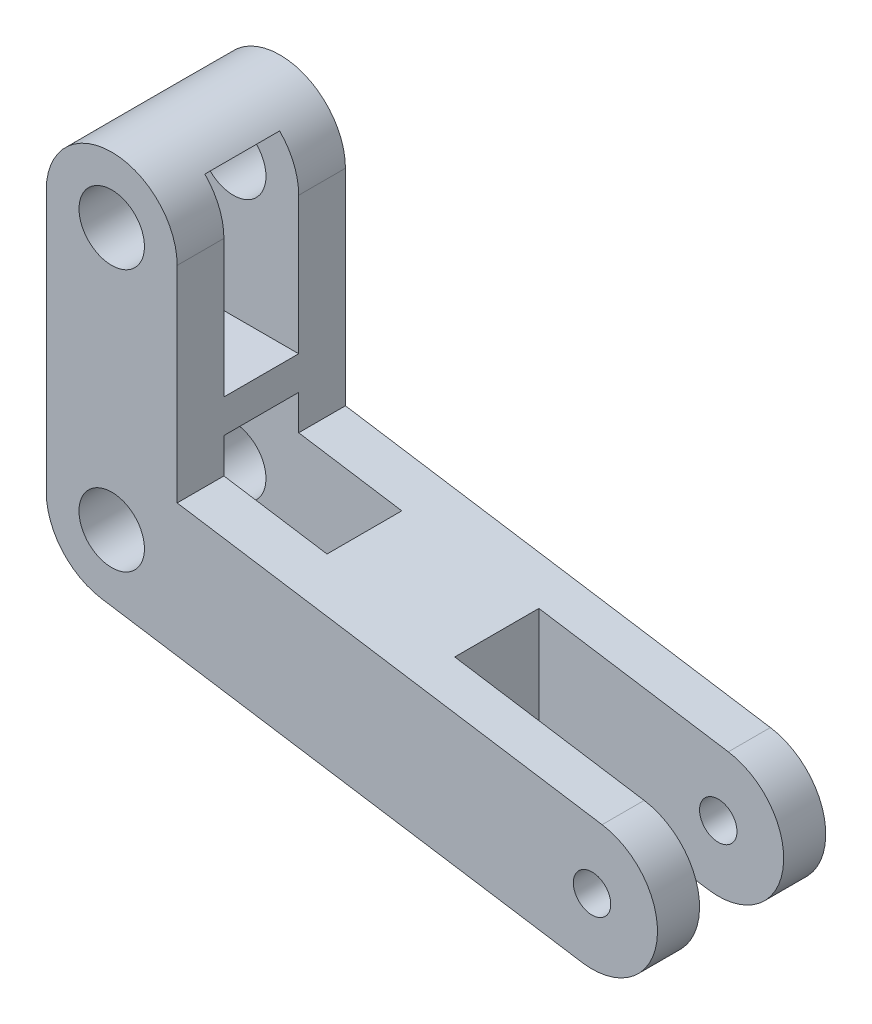
ISO-10303-21;
HEADER;
FILE_DESCRIPTION(('STEP AP214'),'2;1');
FILE_NAME('part.step','',(''),(''),'','','');
FILE_SCHEMA(('AUTOMOTIVE_DESIGN { 1 0 10303 214 1 1 1 1 }'));
ENDSEC;
DATA;
#1=APPLICATION_CONTEXT('core data for automotive mechanical design processes');
#2=APPLICATION_PROTOCOL_DEFINITION('international standard','automotive_design',2000,#1);
#3=PRODUCT_CONTEXT('',#1,'mechanical');
#4=PRODUCT('Part','Part','',(#3));
#5=PRODUCT_RELATED_PRODUCT_CATEGORY('part','',(#4));
#6=PRODUCT_DEFINITION_FORMATION('','',#4);
#7=PRODUCT_DEFINITION_CONTEXT('part definition',#1,'design');
#8=PRODUCT_DEFINITION('design','',#6,#7);
#9=PRODUCT_DEFINITION_SHAPE('','',#8);
#10=(LENGTH_UNIT() NAMED_UNIT(*) SI_UNIT(.MILLI.,.METRE.));
#11=(NAMED_UNIT(*) PLANE_ANGLE_UNIT() SI_UNIT($,.RADIAN.));
#12=(NAMED_UNIT(*) SI_UNIT($,.STERADIAN.) SOLID_ANGLE_UNIT());
#13=UNCERTAINTY_MEASURE_WITH_UNIT(LENGTH_MEASURE(1.E-05),#10,'distance_accuracy_value','');
#14=(GEOMETRIC_REPRESENTATION_CONTEXT(3) GLOBAL_UNCERTAINTY_ASSIGNED_CONTEXT((#13)) GLOBAL_UNIT_ASSIGNED_CONTEXT((#10,
#11,#12)) REPRESENTATION_CONTEXT('',''));
#15=CARTESIAN_POINT('',(0.,0.,0.));
#16=DIRECTION('',(0.,0.,1.));
#17=DIRECTION('',(1.,0.,0.));
#18=AXIS2_PLACEMENT_3D('',#15,#16,#17);
#19=CARTESIAN_POINT('',(25.6904651573303,-4.,4.5));
#20=DIRECTION('',(0.,0.,-1.));
#21=DIRECTION('',(-1.,0.,0.));
#22=AXIS2_PLACEMENT_3D('',#19,#20,#21);
#23=CYLINDRICAL_SURFACE('',#22,3.5);
#24=CARTESIAN_POINT('',(25.6904651573303,-4.,-2.25));
#25=DIRECTION('',(0.,0.,1.));
#26=DIRECTION('',(1.,0.,0.));
#27=AXIS2_PLACEMENT_3D('',#24,#25,#26);
#28=CIRCLE('',#27,3.5);
#29=CARTESIAN_POINT('',(25.1520036188687,-7.45833184810215,-2.25));
#30=VERTEX_POINT('',#29);
#31=CARTESIAN_POINT('',(26.2289266957918,-0.541668151897848,-2.25));
#32=VERTEX_POINT('',#31);
#33=EDGE_CURVE('E231',#30,#32,#28,.T.);
#34=ORIENTED_EDGE('',*,*,#33,.F.);
#35=DIRECTION('',(0.,0.,-1.));
#36=VECTOR('',#35,1.);
#37=CARTESIAN_POINT('',(25.1520036188687,-7.45833184810215,4.5));
#38=LINE('',#37,#36);
#39=CARTESIAN_POINT('',(25.1520036188687,-7.45833184810215,-4.5));
#40=VERTEX_POINT('',#39);
#41=EDGE_CURVE('E343',#30,#40,#38,.T.);
#42=ORIENTED_EDGE('',*,*,#41,.T.);
#43=CARTESIAN_POINT('',(25.6904651573303,-4.,-4.5));
#44=DIRECTION('',(0.,0.,1.));
#45=DIRECTION('',(1.,0.,0.));
#46=AXIS2_PLACEMENT_3D('',#43,#44,#45);
#47=CIRCLE('',#46,3.5);
#48=CARTESIAN_POINT('',(26.2289266957918,-0.541668151897848,-4.5));
#49=VERTEX_POINT('',#48);
#50=EDGE_CURVE('E324',#40,#49,#47,.T.);
#51=ORIENTED_EDGE('',*,*,#50,.T.);
#52=DIRECTION('',(0.,0.,-1.));
#53=VECTOR('',#52,1.);
#54=CARTESIAN_POINT('',(26.2289266957918,-0.541668151897848,4.5));
#55=LINE('',#54,#53);
#56=EDGE_CURVE('E386',#32,#49,#55,.T.);
#57=ORIENTED_EDGE('',*,*,#56,.F.);
#58=EDGE_LOOP('',(#34,#42,#51,#57));
#59=FACE_BOUND('',#58,.T.);
#60=ADVANCED_FACE('F41',(#59),#23,.T.);
#61=CARTESIAN_POINT('',(26.2289266957918,-0.541668151897848,4.5));
#62=DIRECTION('',(-0.153846153846154,-0.988094813743472,0.));
#63=DIRECTION('',(0.988094813743472,-0.153846153846154,0.));
#64=AXIS2_PLACEMENT_3D('',#61,#62,#63);
#65=PLANE('',#64);
#66=DIRECTION('',(-0.988094813743472,0.153846153846154,0.));
#67=VECTOR('',#66,1.);
#68=CARTESIAN_POINT('',(26.2289266957918,-0.541668151897848,-2.25));
#69=LINE('',#68,#67);
#70=CARTESIAN_POINT('',(16.0970559002648,1.03586199144189,-2.25));
#71=VERTEX_POINT('',#70);
#72=EDGE_CURVE('E213',#32,#71,#69,.T.);
#73=ORIENTED_EDGE('',*,*,#72,.F.);
#74=ORIENTED_EDGE('',*,*,#56,.T.);
#75=DIRECTION('',(-0.988094813743471,0.153846153846154,0.));
#76=VECTOR('',#75,1.);
#77=CARTESIAN_POINT('',(26.2289266957918,-0.541668151897848,-4.5));
#78=LINE('',#77,#76);
#79=CARTESIAN_POINT('',(3.50000000000001,2.99722093502187,-4.5));
#80=VERTEX_POINT('',#79);
#81=EDGE_CURVE('E346',#49,#80,#78,.T.);
#82=ORIENTED_EDGE('',*,*,#81,.T.);
#83=DIRECTION('',(0.,0.,-1.));
#84=VECTOR('',#83,1.);
#85=CARTESIAN_POINT('',(3.50000000000001,2.99722093502187,4.5));
#86=LINE('',#85,#84);
#87=CARTESIAN_POINT('',(3.50000000000001,2.99722093502187,-2.));
#88=VERTEX_POINT('',#87);
#89=EDGE_CURVE('E382',#88,#80,#86,.T.);
#90=ORIENTED_EDGE('',*,*,#89,.F.);
#91=DIRECTION('',(0.988094813743472,-0.153846153846154,0.));
#92=VECTOR('',#91,1.);
#93=CARTESIAN_POINT('',(26.2289266957918,-0.541668151897848,-2.));
#94=LINE('',#93,#92);
#95=CARTESIAN_POINT('',(9.01483292771079,2.13856261273186,-2.));
#96=VERTEX_POINT('',#95);
#97=EDGE_CURVE('E299',#88,#96,#94,.T.);
#98=ORIENTED_EDGE('',*,*,#97,.T.);
#99=DIRECTION('',(0.,0.,1.));
#100=VECTOR('',#99,1.);
#101=CARTESIAN_POINT('',(9.01483292771079,2.13856261273186,4.5));
#102=LINE('',#101,#100);
#103=CARTESIAN_POINT('',(9.01483292771079,2.13856261273186,2.));
#104=VERTEX_POINT('',#103);
#105=EDGE_CURVE('E302',#96,#104,#102,.T.);
#106=ORIENTED_EDGE('',*,*,#105,.T.);
#107=DIRECTION('',(0.988094813743472,-0.153846153846154,0.));
#108=VECTOR('',#107,1.);
#109=CARTESIAN_POINT('',(26.2289266957918,-0.541668151897848,2.));
#110=LINE('',#109,#108);
#111=CARTESIAN_POINT('',(3.50000000000001,2.99722093502187,2.));
#112=VERTEX_POINT('',#111);
#113=EDGE_CURVE('E284',#112,#104,#110,.T.);
#114=ORIENTED_EDGE('',*,*,#113,.F.);
#115=CARTESIAN_POINT('',(3.50000000000001,2.99722093502187,4.5));
#116=VERTEX_POINT('',#115);
#117=EDGE_CURVE('E383',#116,#112,#86,.T.);
#118=ORIENTED_EDGE('',*,*,#117,.F.);
#119=DIRECTION('',(-0.988094813743471,0.153846153846154,0.));
#120=VECTOR('',#119,1.);
#121=CARTESIAN_POINT('',(26.2289266957918,-0.541668151897848,4.5));
#122=LINE('',#121,#120);
#123=CARTESIAN_POINT('',(26.2289266957918,-0.541668151897848,4.5));
#124=VERTEX_POINT('',#123);
#125=EDGE_CURVE('E330',#124,#116,#122,.T.);
#126=ORIENTED_EDGE('',*,*,#125,.F.);
#127=CARTESIAN_POINT('',(26.2289266957918,-0.541668151897848,2.25));
#128=VERTEX_POINT('',#127);
#129=EDGE_CURVE('E222',#124,#128,#55,.T.);
#130=ORIENTED_EDGE('',*,*,#129,.T.);
#131=DIRECTION('',(-0.988094813743472,0.153846153846154,0.));
#132=VECTOR('',#131,1.);
#133=CARTESIAN_POINT('',(26.2289266957918,-0.541668151897848,2.25));
#134=LINE('',#133,#132);
#135=CARTESIAN_POINT('',(16.0970559002648,1.03586199144189,2.25));
#136=VERTEX_POINT('',#135);
#137=EDGE_CURVE('E216',#128,#136,#134,.T.);
#138=ORIENTED_EDGE('',*,*,#137,.T.);
#139=DIRECTION('',(0.,0.,-1.));
#140=VECTOR('',#139,1.);
#141=CARTESIAN_POINT('',(16.0970559002648,1.03586199144189,4.5));
#142=LINE('',#141,#140);
#143=EDGE_CURVE('E203',#136,#71,#142,.T.);
#144=ORIENTED_EDGE('',*,*,#143,.T.);
#145=EDGE_LOOP('',(#73,#74,#82,#90,#98,#106,#114,#118,#126,#130,#138,#144));
#146=FACE_BOUND('',#145,.T.);
#147=ADVANCED_FACE('F220',(#146),#65,.F.);
#148=CARTESIAN_POINT('',(25.1520036188687,-7.45833184810215,4.5));
#149=DIRECTION('',(0.153846153846154,0.988094813743472,0.));
#150=DIRECTION('',(-0.988094813743472,0.153846153846154,0.));
#151=AXIS2_PLACEMENT_3D('',#148,#149,#150);
#152=PLANE('',#151);
#153=DIRECTION('',(0.988094813743472,-0.153846153846154,0.));
#154=VECTOR('',#153,1.);
#155=CARTESIAN_POINT('',(25.1520036188687,-7.45833184810215,-2.25));
#156=LINE('',#155,#154);
#157=CARTESIAN_POINT('',(16.0970559002648,-6.04847840042797,-2.25));
#158=VERTEX_POINT('',#157);
#159=EDGE_CURVE('E226',#158,#30,#156,.T.);
#160=ORIENTED_EDGE('',*,*,#159,.F.);
#161=DIRECTION('',(0.,0.,1.));
#162=VECTOR('',#161,1.);
#163=CARTESIAN_POINT('',(16.0970559002648,-6.04847840042797,4.5));
#164=LINE('',#163,#162);
#165=CARTESIAN_POINT('',(16.0970559002648,-6.04847840042797,2.25));
#166=VERTEX_POINT('',#165);
#167=EDGE_CURVE('E11',#158,#166,#164,.T.);
#168=ORIENTED_EDGE('',*,*,#167,.T.);
#169=DIRECTION('',(0.988094813743472,-0.153846153846154,0.));
#170=VECTOR('',#169,1.);
#171=CARTESIAN_POINT('',(25.1520036188687,-7.45833184810215,2.25));
#172=LINE('',#171,#170);
#173=CARTESIAN_POINT('',(25.1520036188687,-7.45833184810215,2.25));
#174=VERTEX_POINT('',#173);
#175=EDGE_CURVE('E217',#166,#174,#172,.T.);
#176=ORIENTED_EDGE('',*,*,#175,.T.);
#177=CARTESIAN_POINT('',(25.1520036188687,-7.45833184810215,4.5));
#178=VERTEX_POINT('',#177);
#179=EDGE_CURVE('E363',#178,#174,#38,.T.);
#180=ORIENTED_EDGE('',*,*,#179,.F.);
#181=DIRECTION('',(0.988094813743471,-0.153846153846154,0.));
#182=VECTOR('',#181,1.);
#183=CARTESIAN_POINT('',(25.1520036188687,-7.45833184810215,4.5));
#184=LINE('',#183,#182);
#185=CARTESIAN_POINT('',(-0.538461538461539,-3.45833184810215,4.5));
#186=VERTEX_POINT('',#185);
#187=EDGE_CURVE('E341',#186,#178,#184,.T.);
#188=ORIENTED_EDGE('',*,*,#187,.F.);
#189=DIRECTION('',(0.,0.,-1.));
#190=VECTOR('',#189,1.);
#191=CARTESIAN_POINT('',(-0.538461538461539,-3.45833184810215,4.5));
#192=LINE('',#191,#190);
#193=CARTESIAN_POINT('',(-0.53846153846154,-3.45833184810215,2.));
#194=VERTEX_POINT('',#193);
#195=EDGE_CURVE('E367',#186,#194,#192,.T.);
#196=ORIENTED_EDGE('',*,*,#195,.T.);
#197=DIRECTION('',(-0.988094813743472,0.153846153846154,0.));
#198=VECTOR('',#197,1.);
#199=CARTESIAN_POINT('',(25.1520036188687,-7.45833184810215,2.));
#200=LINE('',#199,#198);
#201=CARTESIAN_POINT('',(9.01483292771079,-4.94577777913801,2.));
#202=VERTEX_POINT('',#201);
#203=EDGE_CURVE('E275',#202,#194,#200,.T.);
#204=ORIENTED_EDGE('',*,*,#203,.F.);
#205=DIRECTION('',(0.,0.,-1.));
#206=VECTOR('',#205,1.);
#207=CARTESIAN_POINT('',(9.01483292771079,-4.94577777913801,4.5));
#208=LINE('',#207,#206);
#209=CARTESIAN_POINT('',(9.01483292771079,-4.94577777913801,-2.));
#210=VERTEX_POINT('',#209);
#211=EDGE_CURVE('E388',#202,#210,#208,.T.);
#212=ORIENTED_EDGE('',*,*,#211,.T.);
#213=DIRECTION('',(-0.988094813743472,0.153846153846154,0.));
#214=VECTOR('',#213,1.);
#215=CARTESIAN_POINT('',(25.1520036188687,-7.45833184810215,-2.));
#216=LINE('',#215,#214);
#217=CARTESIAN_POINT('',(-0.53846153846154,-3.45833184810215,-2.));
#218=VERTEX_POINT('',#217);
#219=EDGE_CURVE('E287',#210,#218,#216,.T.);
#220=ORIENTED_EDGE('',*,*,#219,.T.);
#221=CARTESIAN_POINT('',(-0.538461538461539,-3.45833184810215,-4.5));
#222=VERTEX_POINT('',#221);
#223=EDGE_CURVE('E366',#218,#222,#192,.T.);
#224=ORIENTED_EDGE('',*,*,#223,.T.);
#225=DIRECTION('',(0.988094813743471,-0.153846153846154,0.));
#226=VECTOR('',#225,1.);
#227=CARTESIAN_POINT('',(25.1520036188687,-7.45833184810215,-4.5));
#228=LINE('',#227,#226);
#229=EDGE_CURVE('E331',#222,#40,#228,.T.);
#230=ORIENTED_EDGE('',*,*,#229,.T.);
#231=ORIENTED_EDGE('',*,*,#41,.F.);
#232=EDGE_LOOP('',(#160,#168,#176,#180,#188,#196,#204,#212,#220,#224,#230,#231));
#233=FACE_BOUND('',#232,.T.);
#234=ADVANCED_FACE('F421',(#233),#152,.F.);
#235=CARTESIAN_POINT('',(25.6904651573303,-4.,4.5));
#236=DIRECTION('',(0.,0.,-1.));
#237=DIRECTION('',(-1.,0.,0.));
#238=AXIS2_PLACEMENT_3D('',#235,#236,#237);
#239=CYLINDRICAL_SURFACE('',#238,0.999999999999998);
#240=CARTESIAN_POINT('',(25.6904651573303,-4.,-4.5));
#241=DIRECTION('',(0.,0.,1.));
#242=DIRECTION('',(1.,0.,0.));
#243=AXIS2_PLACEMENT_3D('',#240,#241,#242);
#244=CIRCLE('',#243,0.999999999999998);
#245=CARTESIAN_POINT('',(26.6904651573303,-4.,-4.5));
#246=VERTEX_POINT('',#245);
#247=EDGE_CURVE('E312',#246,#246,#244,.T.);
#248=ORIENTED_EDGE('',*,*,#247,.F.);
#249=EDGE_LOOP('',(#248));
#250=FACE_BOUND('',#249,.T.);
#251=CARTESIAN_POINT('',(25.6904651573303,-4.,-2.25));
#252=DIRECTION('',(0.,0.,1.));
#253=DIRECTION('',(1.,0.,0.));
#254=AXIS2_PLACEMENT_3D('',#251,#252,#253);
#255=CIRCLE('',#254,0.999999999999998);
#256=CARTESIAN_POINT('',(26.6904651573303,-4.,-2.25));
#257=VERTEX_POINT('',#256);
#258=EDGE_CURVE('E223',#257,#257,#255,.T.);
#259=ORIENTED_EDGE('',*,*,#258,.T.);
#260=EDGE_LOOP('',(#259));
#261=FACE_BOUND('',#260,.T.);
#262=ADVANCED_FACE('F495',(#250,#261),#239,.F.);
#263=CARTESIAN_POINT('',(3.5,14.,4.5));
#264=DIRECTION('',(-1.,0.,0.));
#265=DIRECTION('',(0.,-1.,0.));
#266=AXIS2_PLACEMENT_3D('',#263,#264,#265);
#267=PLANE('',#266);
#268=DIRECTION('',(0.,1.,0.));
#269=VECTOR('',#268,1.);
#270=CARTESIAN_POINT('',(3.5,16.4698635435501,-2.));
#271=LINE('',#270,#269);
#272=CARTESIAN_POINT('',(3.5,6.65669603838257,-2.));
#273=VERTEX_POINT('',#272);
#274=CARTESIAN_POINT('',(3.5,14.,-2.));
#275=VERTEX_POINT('',#274);
#276=EDGE_CURVE('E236',#273,#275,#271,.T.);
#277=ORIENTED_EDGE('',*,*,#276,.F.);
#278=DIRECTION('',(0.,0.,1.));
#279=VECTOR('',#278,1.);
#280=CARTESIAN_POINT('',(3.5,6.65669603838257,-2.));
#281=LINE('',#280,#279);
#282=CARTESIAN_POINT('',(3.5,6.65669603838257,2.));
#283=VERTEX_POINT('',#282);
#284=EDGE_CURVE('E242',#273,#283,#281,.T.);
#285=ORIENTED_EDGE('',*,*,#284,.T.);
#286=DIRECTION('',(0.,1.,0.));
#287=VECTOR('',#286,1.);
#288=CARTESIAN_POINT('',(3.5,16.4698635435501,2.));
#289=LINE('',#288,#287);
#290=CARTESIAN_POINT('',(3.5,14.,2.));
#291=VERTEX_POINT('',#290);
#292=EDGE_CURVE('E245',#283,#291,#289,.T.);
#293=ORIENTED_EDGE('',*,*,#292,.T.);
#294=DIRECTION('',(0.,0.,-1.));
#295=VECTOR('',#294,1.);
#296=CARTESIAN_POINT('',(3.5,14.,4.5));
#297=LINE('',#296,#295);
#298=CARTESIAN_POINT('',(3.5,14.,4.5));
#299=VERTEX_POINT('',#298);
#300=EDGE_CURVE('E379',#299,#291,#297,.T.);
#301=ORIENTED_EDGE('',*,*,#300,.F.);
#302=DIRECTION('',(0.,1.,0.));
#303=VECTOR('',#302,1.);
#304=CARTESIAN_POINT('',(3.5,14.,4.5));
#305=LINE('',#304,#303);
#306=EDGE_CURVE('E333',#116,#299,#305,.T.);
#307=ORIENTED_EDGE('',*,*,#306,.F.);
#308=ORIENTED_EDGE('',*,*,#117,.T.);
#309=DIRECTION('',(0.,-1.,0.));
#310=VECTOR('',#309,1.);
#311=CARTESIAN_POINT('',(3.5,14.,2.));
#312=LINE('',#311,#310);
#313=CARTESIAN_POINT('',(3.50000000000001,4.86934920884361,2.));
#314=VERTEX_POINT('',#313);
#315=EDGE_CURVE('E282',#314,#112,#312,.T.);
#316=ORIENTED_EDGE('',*,*,#315,.F.);
#317=DIRECTION('',(0.,0.,-1.));
#318=VECTOR('',#317,1.);
#319=CARTESIAN_POINT('',(3.50000000000001,4.86934920884361,4.5));
#320=LINE('',#319,#318);
#321=CARTESIAN_POINT('',(3.50000000000001,4.86934920884361,-2.));
#322=VERTEX_POINT('',#321);
#323=EDGE_CURVE('E305',#314,#322,#320,.T.);
#324=ORIENTED_EDGE('',*,*,#323,.T.);
#325=DIRECTION('',(0.,-1.,0.));
#326=VECTOR('',#325,1.);
#327=CARTESIAN_POINT('',(3.5,14.,-2.));
#328=LINE('',#327,#326);
#329=EDGE_CURVE('E296',#322,#88,#328,.T.);
#330=ORIENTED_EDGE('',*,*,#329,.T.);
#331=ORIENTED_EDGE('',*,*,#89,.T.);
#332=DIRECTION('',(0.,1.,0.));
#333=VECTOR('',#332,1.);
#334=CARTESIAN_POINT('',(3.5,14.,-4.5));
#335=LINE('',#334,#333);
#336=CARTESIAN_POINT('',(3.5,14.,-4.5));
#337=VERTEX_POINT('',#336);
#338=EDGE_CURVE('E349',#80,#337,#335,.T.);
#339=ORIENTED_EDGE('',*,*,#338,.T.);
#340=EDGE_CURVE('E378',#275,#337,#297,.T.);
#341=ORIENTED_EDGE('',*,*,#340,.F.);
#342=EDGE_LOOP('',(#277,#285,#293,#301,#307,#308,#316,#324,#330,#331,#339,#341));
#343=FACE_BOUND('',#342,.T.);
#344=ADVANCED_FACE('F437',(#343),#267,.F.);
#345=CARTESIAN_POINT('',(0.,14.,4.5));
#346=DIRECTION('',(0.,0.,-1.));
#347=DIRECTION('',(-1.,0.,0.));
#348=AXIS2_PLACEMENT_3D('',#345,#346,#347);
#349=CYLINDRICAL_SURFACE('',#348,3.5);
#350=CARTESIAN_POINT('',(0.,14.,-2.));
#351=DIRECTION('',(0.,0.,1.));
#352=DIRECTION('',(1.,0.,0.));
#353=AXIS2_PLACEMENT_3D('',#350,#351,#352);
#354=CIRCLE('',#353,3.5);
#355=CARTESIAN_POINT('',(2.47987380248311,16.4698635435501,-2.));
#356=VERTEX_POINT('',#355);
#357=EDGE_CURVE('E274',#275,#356,#354,.T.);
#358=ORIENTED_EDGE('',*,*,#357,.F.);
#359=ORIENTED_EDGE('',*,*,#340,.T.);
#360=CARTESIAN_POINT('',(0.,14.,-4.5));
#361=DIRECTION('',(0.,0.,1.));
#362=DIRECTION('',(1.,0.,0.));
#363=AXIS2_PLACEMENT_3D('',#360,#361,#362);
#364=CIRCLE('',#363,3.5);
#365=CARTESIAN_POINT('',(-3.5,14.,-4.5));
#366=VERTEX_POINT('',#365);
#367=EDGE_CURVE('E352',#337,#366,#364,.T.);
#368=ORIENTED_EDGE('',*,*,#367,.T.);
#369=DIRECTION('',(0.,0.,-1.));
#370=VECTOR('',#369,1.);
#371=CARTESIAN_POINT('',(-3.5,14.,4.5));
#372=LINE('',#371,#370);
#373=CARTESIAN_POINT('',(-3.5,14.,-2.));
#374=VERTEX_POINT('',#373);
#375=EDGE_CURVE('E374',#374,#366,#372,.T.);
#376=ORIENTED_EDGE('',*,*,#375,.F.);
#377=CARTESIAN_POINT('',(-2.47987380248311,16.4698635435501,-2.));
#378=VERTEX_POINT('',#377);
#379=EDGE_CURVE('E271',#378,#374,#354,.T.);
#380=ORIENTED_EDGE('',*,*,#379,.F.);
#381=DIRECTION('',(0.,0.,-1.));
#382=VECTOR('',#381,1.);
#383=CARTESIAN_POINT('',(-2.47987380248311,16.4698635435501,4.5));
#384=LINE('',#383,#382);
#385=CARTESIAN_POINT('',(-2.47987380248311,16.4698635435501,2.));
#386=VERTEX_POINT('',#385);
#387=EDGE_CURVE('E405',#378,#386,#384,.F.);
#388=ORIENTED_EDGE('',*,*,#387,.T.);
#389=CARTESIAN_POINT('',(0.,14.,2.));
#390=DIRECTION('',(0.,0.,1.));
#391=DIRECTION('',(1.,0.,0.));
#392=AXIS2_PLACEMENT_3D('',#389,#390,#391);
#393=CIRCLE('',#392,3.5);
#394=CARTESIAN_POINT('',(-3.5,14.,2.));
#395=VERTEX_POINT('',#394);
#396=EDGE_CURVE('E265',#386,#395,#393,.T.);
#397=ORIENTED_EDGE('',*,*,#396,.T.);
#398=CARTESIAN_POINT('',(-3.5,14.,4.5));
#399=VERTEX_POINT('',#398);
#400=EDGE_CURVE('E375',#399,#395,#372,.T.);
#401=ORIENTED_EDGE('',*,*,#400,.F.);
#402=CARTESIAN_POINT('',(0.,14.,4.5));
#403=DIRECTION('',(0.,0.,1.));
#404=DIRECTION('',(1.,0.,0.));
#405=AXIS2_PLACEMENT_3D('',#402,#403,#404);
#406=CIRCLE('',#405,3.5);
#407=EDGE_CURVE('E335',#299,#399,#406,.T.);
#408=ORIENTED_EDGE('',*,*,#407,.F.);
#409=ORIENTED_EDGE('',*,*,#300,.T.);
#410=CARTESIAN_POINT('',(2.47987380248311,16.4698635435501,2.));
#411=VERTEX_POINT('',#410);
#412=EDGE_CURVE('E268',#291,#411,#393,.T.);
#413=ORIENTED_EDGE('',*,*,#412,.T.);
#414=DIRECTION('',(0.,0.,-1.));
#415=VECTOR('',#414,1.);
#416=CARTESIAN_POINT('',(2.47987380248311,16.4698635435501,4.5));
#417=LINE('',#416,#415);
#418=EDGE_CURVE('E49',#411,#356,#417,.T.);
#419=ORIENTED_EDGE('',*,*,#418,.T.);
#420=EDGE_LOOP('',(#358,#359,#368,#376,#380,#388,#397,#401,#408,#409,#413,#419));
#421=FACE_BOUND('',#420,.T.);
#422=ADVANCED_FACE('F500',(#421),#349,.T.);
#423=CARTESIAN_POINT('',(-3.5,14.,4.5));
#424=DIRECTION('',(1.,0.,0.));
#425=DIRECTION('',(0.,1.,0.));
#426=AXIS2_PLACEMENT_3D('',#423,#424,#425);
#427=PLANE('',#426);
#428=DIRECTION('',(0.,-1.,0.));
#429=VECTOR('',#428,1.);
#430=CARTESIAN_POINT('',(-3.5,14.,-2.));
#431=LINE('',#430,#429);
#432=CARTESIAN_POINT('',(-3.5,6.65669603838257,-2.));
#433=VERTEX_POINT('',#432);
#434=EDGE_CURVE('E269',#374,#433,#431,.T.);
#435=ORIENTED_EDGE('',*,*,#434,.F.);
#436=ORIENTED_EDGE('',*,*,#375,.T.);
#437=DIRECTION('',(0.,-1.,0.));
#438=VECTOR('',#437,1.);
#439=CARTESIAN_POINT('',(-3.5,14.,-4.5));
#440=LINE('',#439,#438);
#441=CARTESIAN_POINT('',(-3.5,0.,-4.5));
#442=VERTEX_POINT('',#441);
#443=EDGE_CURVE('E355',#366,#442,#440,.T.);
#444=ORIENTED_EDGE('',*,*,#443,.T.);
#445=DIRECTION('',(0.,0.,-1.));
#446=VECTOR('',#445,1.);
#447=CARTESIAN_POINT('',(-3.5,0.,4.5));
#448=LINE('',#447,#446);
#449=CARTESIAN_POINT('',(-3.5,0.,-2.));
#450=VERTEX_POINT('',#449);
#451=EDGE_CURVE('E370',#450,#442,#448,.T.);
#452=ORIENTED_EDGE('',*,*,#451,.F.);
#453=DIRECTION('',(0.,1.,0.));
#454=VECTOR('',#453,1.);
#455=CARTESIAN_POINT('',(-3.5,14.,-2.));
#456=LINE('',#455,#454);
#457=CARTESIAN_POINT('',(-3.5,4.86934920884361,-2.));
#458=VERTEX_POINT('',#457);
#459=EDGE_CURVE('E293',#450,#458,#456,.T.);
#460=ORIENTED_EDGE('',*,*,#459,.T.);
#461=DIRECTION('',(0.,0.,1.));
#462=VECTOR('',#461,1.);
#463=CARTESIAN_POINT('',(-3.5,4.86934920884361,4.5));
#464=LINE('',#463,#462);
#465=CARTESIAN_POINT('',(-3.5,4.86934920884361,2.));
#466=VERTEX_POINT('',#465);
#467=EDGE_CURVE('E399',#458,#466,#464,.T.);
#468=ORIENTED_EDGE('',*,*,#467,.T.);
#469=DIRECTION('',(0.,1.,0.));
#470=VECTOR('',#469,1.);
#471=CARTESIAN_POINT('',(-3.5,14.,2.));
#472=LINE('',#471,#470);
#473=CARTESIAN_POINT('',(-3.5,0.,2.));
#474=VERTEX_POINT('',#473);
#475=EDGE_CURVE('E280',#474,#466,#472,.T.);
#476=ORIENTED_EDGE('',*,*,#475,.F.);
#477=CARTESIAN_POINT('',(-3.5,0.,4.5));
#478=VERTEX_POINT('',#477);
#479=EDGE_CURVE('E371',#478,#474,#448,.T.);
#480=ORIENTED_EDGE('',*,*,#479,.F.);
#481=DIRECTION('',(0.,-1.,0.));
#482=VECTOR('',#481,1.);
#483=CARTESIAN_POINT('',(-3.5,14.,4.5));
#484=LINE('',#483,#482);
#485=EDGE_CURVE('E337',#399,#478,#484,.T.);
#486=ORIENTED_EDGE('',*,*,#485,.F.);
#487=ORIENTED_EDGE('',*,*,#400,.T.);
#488=DIRECTION('',(0.,-1.,0.));
#489=VECTOR('',#488,1.);
#490=CARTESIAN_POINT('',(-3.5,14.,2.));
#491=LINE('',#490,#489);
#492=CARTESIAN_POINT('',(-3.5,6.65669603838257,2.));
#493=VERTEX_POINT('',#492);
#494=EDGE_CURVE('E262',#395,#493,#491,.T.);
#495=ORIENTED_EDGE('',*,*,#494,.T.);
#496=DIRECTION('',(0.,0.,-1.));
#497=VECTOR('',#496,1.);
#498=CARTESIAN_POINT('',(-3.5,6.65669603838257,4.5));
#499=LINE('',#498,#497);
#500=EDGE_CURVE('E402',#493,#433,#499,.T.);
#501=ORIENTED_EDGE('',*,*,#500,.T.);
#502=EDGE_LOOP('',(#435,#436,#444,#452,#460,#468,#476,#480,#486,#487,#495,#501));
#503=FACE_BOUND('',#502,.T.);
#504=ADVANCED_FACE('F460',(#503),#427,.F.);
#505=CARTESIAN_POINT('',(0.,0.,4.5));
#506=DIRECTION('',(0.,0.,-1.));
#507=DIRECTION('',(-1.,0.,0.));
#508=AXIS2_PLACEMENT_3D('',#505,#506,#507);
#509=CYLINDRICAL_SURFACE('',#508,3.5);
#510=CARTESIAN_POINT('',(0.,0.,2.));
#511=DIRECTION('',(0.,0.,-1.));
#512=DIRECTION('',(-1.,0.,0.));
#513=AXIS2_PLACEMENT_3D('',#510,#511,#512);
#514=CIRCLE('',#513,3.5);
#515=EDGE_CURVE('E277',#194,#474,#514,.T.);
#516=ORIENTED_EDGE('',*,*,#515,.F.);
#517=ORIENTED_EDGE('',*,*,#195,.F.);
#518=CARTESIAN_POINT('',(0.,0.,4.5));
#519=DIRECTION('',(0.,0.,1.));
#520=DIRECTION('',(1.,0.,0.));
#521=AXIS2_PLACEMENT_3D('',#518,#519,#520);
#522=CIRCLE('',#521,3.5);
#523=EDGE_CURVE('E339',#478,#186,#522,.T.);
#524=ORIENTED_EDGE('',*,*,#523,.F.);
#525=ORIENTED_EDGE('',*,*,#479,.T.);
#526=EDGE_LOOP('',(#516,#517,#524,#525));
#527=FACE_BOUND('',#526,.T.);
#528=ADVANCED_FACE('F454',(#527),#509,.T.);
#529=CARTESIAN_POINT('',(0.,0.,4.5));
#530=DIRECTION('',(0.,0.,-1.));
#531=DIRECTION('',(-1.,0.,0.));
#532=AXIS2_PLACEMENT_3D('',#529,#530,#531);
#533=CYLINDRICAL_SURFACE('',#532,1.75);
#534=CARTESIAN_POINT('',(0.,0.,4.5));
#535=DIRECTION('',(0.,0.,1.));
#536=DIRECTION('',(1.,0.,0.));
#537=AXIS2_PLACEMENT_3D('',#534,#535,#536);
#538=CIRCLE('',#537,1.75);
#539=CARTESIAN_POINT('',(1.75,0.,4.5));
#540=VERTEX_POINT('',#539);
#541=EDGE_CURVE('E321',#540,#540,#538,.T.);
#542=ORIENTED_EDGE('',*,*,#541,.T.);
#543=EDGE_LOOP('',(#542));
#544=FACE_BOUND('',#543,.T.);
#545=CARTESIAN_POINT('',(0.,0.,2.));
#546=DIRECTION('',(0.,0.,-1.));
#547=DIRECTION('',(-1.,0.,0.));
#548=AXIS2_PLACEMENT_3D('',#545,#546,#547);
#549=CIRCLE('',#548,1.75);
#550=CARTESIAN_POINT('',(-1.75,0.,2.));
#551=VERTEX_POINT('',#550);
#552=EDGE_CURVE('E278',#551,#551,#549,.T.);
#553=ORIENTED_EDGE('',*,*,#552,.T.);
#554=EDGE_LOOP('',(#553));
#555=FACE_BOUND('',#554,.T.);
#556=ADVANCED_FACE('F514',(#544,#555),#533,.F.);
#557=CARTESIAN_POINT('',(0.,14.,4.5));
#558=DIRECTION('',(0.,0.,-1.));
#559=DIRECTION('',(-1.,0.,0.));
#560=AXIS2_PLACEMENT_3D('',#557,#558,#559);
#561=CYLINDRICAL_SURFACE('',#560,1.75);
#562=CARTESIAN_POINT('',(0.,14.,-4.5));
#563=DIRECTION('',(0.,0.,1.));
#564=DIRECTION('',(1.,0.,0.));
#565=AXIS2_PLACEMENT_3D('',#562,#563,#564);
#566=CIRCLE('',#565,1.75);
#567=CARTESIAN_POINT('',(1.75,14.,-4.5));
#568=VERTEX_POINT('',#567);
#569=EDGE_CURVE('E308',#568,#568,#566,.T.);
#570=ORIENTED_EDGE('',*,*,#569,.F.);
#571=EDGE_LOOP('',(#570));
#572=FACE_BOUND('',#571,.T.);
#573=CARTESIAN_POINT('',(0.,14.,-2.));
#574=DIRECTION('',(0.,0.,1.));
#575=DIRECTION('',(1.,0.,0.));
#576=AXIS2_PLACEMENT_3D('',#573,#574,#575);
#577=CIRCLE('',#576,1.75);
#578=CARTESIAN_POINT('',(1.75,14.,-2.));
#579=VERTEX_POINT('',#578);
#580=EDGE_CURVE('E272',#579,#579,#577,.T.);
#581=ORIENTED_EDGE('',*,*,#580,.T.);
#582=EDGE_LOOP('',(#581));
#583=FACE_BOUND('',#582,.T.);
#584=ADVANCED_FACE('F508',(#572,#583),#561,.F.);
#585=CARTESIAN_POINT('',(25.6904651573303,-4.,4.5));
#586=DIRECTION('',(0.,0.,1.));
#587=DIRECTION('',(1.,0.,0.));
#588=AXIS2_PLACEMENT_3D('',#585,#586,#587);
#589=PLANE('',#588);
#590=CARTESIAN_POINT('',(25.6904651573303,-4.,4.5));
#591=DIRECTION('',(0.,0.,1.));
#592=DIRECTION('',(1.,0.,0.));
#593=AXIS2_PLACEMENT_3D('',#590,#591,#592);
#594=CIRCLE('',#593,0.999999999999998);
#595=CARTESIAN_POINT('',(26.6904651573303,-4.,4.5));
#596=VERTEX_POINT('',#595);
#597=EDGE_CURVE('E315',#596,#596,#594,.T.);
#598=ORIENTED_EDGE('',*,*,#597,.F.);
#599=EDGE_LOOP('',(#598));
#600=FACE_BOUND('',#599,.T.);
#601=CARTESIAN_POINT('',(25.6904651573303,-4.,4.5));
#602=DIRECTION('',(0.,0.,1.));
#603=DIRECTION('',(1.,0.,0.));
#604=AXIS2_PLACEMENT_3D('',#601,#602,#603);
#605=CIRCLE('',#604,3.5);
#606=EDGE_CURVE('E327',#178,#124,#605,.T.);
#607=ORIENTED_EDGE('',*,*,#606,.T.);
#608=ORIENTED_EDGE('',*,*,#125,.T.);
#609=ORIENTED_EDGE('',*,*,#306,.T.);
#610=ORIENTED_EDGE('',*,*,#407,.T.);
#611=ORIENTED_EDGE('',*,*,#485,.T.);
#612=ORIENTED_EDGE('',*,*,#523,.T.);
#613=ORIENTED_EDGE('',*,*,#187,.T.);
#614=EDGE_LOOP('',(#607,#608,#609,#610,#611,#612,#613));
#615=FACE_BOUND('',#614,.T.);
#616=ORIENTED_EDGE('',*,*,#541,.F.);
#617=EDGE_LOOP('',(#616));
#618=FACE_BOUND('',#617,.T.);
#619=CARTESIAN_POINT('',(0.,14.,4.5));
#620=DIRECTION('',(0.,0.,1.));
#621=DIRECTION('',(1.,0.,0.));
#622=AXIS2_PLACEMENT_3D('',#619,#620,#621);
#623=CIRCLE('',#622,1.75);
#624=CARTESIAN_POINT('',(1.75,14.,4.5));
#625=VERTEX_POINT('',#624);
#626=EDGE_CURVE('E309',#625,#625,#623,.T.);
#627=ORIENTED_EDGE('',*,*,#626,.F.);
#628=EDGE_LOOP('',(#627));
#629=FACE_BOUND('',#628,.T.);
#630=ADVANCED_FACE('F469',(#600,#615,#618,#629),#589,.T.);
#631=CARTESIAN_POINT('',(25.6904651573303,-4.,-4.5));
#632=DIRECTION('',(0.,0.,1.));
#633=DIRECTION('',(1.,0.,0.));
#634=AXIS2_PLACEMENT_3D('',#631,#632,#633);
#635=PLANE('',#634);
#636=ORIENTED_EDGE('',*,*,#50,.F.);
#637=ORIENTED_EDGE('',*,*,#229,.F.);
#638=CARTESIAN_POINT('',(0.,0.,-4.5));
#639=DIRECTION('',(0.,0.,1.));
#640=DIRECTION('',(1.,0.,0.));
#641=AXIS2_PLACEMENT_3D('',#638,#639,#640);
#642=CIRCLE('',#641,3.5);
#643=EDGE_CURVE('E358',#442,#222,#642,.T.);
#644=ORIENTED_EDGE('',*,*,#643,.F.);
#645=ORIENTED_EDGE('',*,*,#443,.F.);
#646=ORIENTED_EDGE('',*,*,#367,.F.);
#647=ORIENTED_EDGE('',*,*,#338,.F.);
#648=ORIENTED_EDGE('',*,*,#81,.F.);
#649=EDGE_LOOP('',(#636,#637,#644,#645,#646,#647,#648));
#650=FACE_BOUND('',#649,.T.);
#651=CARTESIAN_POINT('',(0.,0.,-4.5));
#652=DIRECTION('',(0.,0.,1.));
#653=DIRECTION('',(1.,0.,0.));
#654=AXIS2_PLACEMENT_3D('',#651,#652,#653);
#655=CIRCLE('',#654,1.75);
#656=CARTESIAN_POINT('',(1.75,0.,-4.5));
#657=VERTEX_POINT('',#656);
#658=EDGE_CURVE('E318',#657,#657,#655,.T.);
#659=ORIENTED_EDGE('',*,*,#658,.T.);
#660=EDGE_LOOP('',(#659));
#661=FACE_BOUND('',#660,.T.);
#662=ORIENTED_EDGE('',*,*,#247,.T.);
#663=EDGE_LOOP('',(#662));
#664=FACE_BOUND('',#663,.T.);
#665=ORIENTED_EDGE('',*,*,#569,.T.);
#666=EDGE_LOOP('',(#665));
#667=FACE_BOUND('',#666,.T.);
#668=ADVANCED_FACE('F430',(#650,#661,#664,#667),#635,.F.);
#669=ORIENTED_EDGE('',*,*,#179,.T.);
#670=CARTESIAN_POINT('',(25.6904651573303,-4.,2.25));
#671=DIRECTION('',(0.,0.,1.));
#672=DIRECTION('',(1.,0.,0.));
#673=AXIS2_PLACEMENT_3D('',#670,#671,#672);
#674=CIRCLE('',#673,3.5);
#675=EDGE_CURVE('E56',#174,#128,#674,.T.);
#676=ORIENTED_EDGE('',*,*,#675,.T.);
#677=ORIENTED_EDGE('',*,*,#129,.F.);
#678=ORIENTED_EDGE('',*,*,#606,.F.);
#679=EDGE_LOOP('',(#669,#676,#677,#678));
#680=FACE_BOUND('',#679,.T.);
#681=ADVANCED_FACE('F43',(#680),#23,.T.);
#682=ORIENTED_EDGE('',*,*,#223,.F.);
#683=CARTESIAN_POINT('',(0.,0.,-2.));
#684=DIRECTION('',(0.,0.,-1.));
#685=DIRECTION('',(-1.,0.,0.));
#686=AXIS2_PLACEMENT_3D('',#683,#684,#685);
#687=CIRCLE('',#686,3.5);
#688=EDGE_CURVE('E290',#218,#450,#687,.T.);
#689=ORIENTED_EDGE('',*,*,#688,.T.);
#690=ORIENTED_EDGE('',*,*,#451,.T.);
#691=ORIENTED_EDGE('',*,*,#643,.T.);
#692=EDGE_LOOP('',(#682,#689,#690,#691));
#693=FACE_BOUND('',#692,.T.);
#694=ADVANCED_FACE('F476',(#693),#509,.T.);
#695=CARTESIAN_POINT('',(0.,0.,-2.));
#696=DIRECTION('',(0.,0.,-1.));
#697=DIRECTION('',(-1.,0.,0.));
#698=AXIS2_PLACEMENT_3D('',#695,#696,#697);
#699=CIRCLE('',#698,1.75);
#700=CARTESIAN_POINT('',(-1.75,0.,-2.));
#701=VERTEX_POINT('',#700);
#702=EDGE_CURVE('E286',#701,#701,#699,.T.);
#703=ORIENTED_EDGE('',*,*,#702,.F.);
#704=EDGE_LOOP('',(#703));
#705=FACE_BOUND('',#704,.T.);
#706=ORIENTED_EDGE('',*,*,#658,.F.);
#707=EDGE_LOOP('',(#706));
#708=FACE_BOUND('',#707,.T.);
#709=ADVANCED_FACE('F482',(#705,#708),#533,.F.);
#710=CARTESIAN_POINT('',(25.6904651573303,-4.,2.25));
#711=DIRECTION('',(0.,0.,1.));
#712=DIRECTION('',(1.,0.,0.));
#713=AXIS2_PLACEMENT_3D('',#710,#711,#712);
#714=CIRCLE('',#713,0.999999999999998);
#715=CARTESIAN_POINT('',(26.6904651573303,-4.,2.25));
#716=VERTEX_POINT('',#715);
#717=EDGE_CURVE('E410',#716,#716,#714,.T.);
#718=ORIENTED_EDGE('',*,*,#717,.F.);
#719=EDGE_LOOP('',(#718));
#720=FACE_BOUND('',#719,.T.);
#721=ORIENTED_EDGE('',*,*,#597,.T.);
#722=EDGE_LOOP('',(#721));
#723=FACE_BOUND('',#722,.T.);
#724=ADVANCED_FACE('F512',(#720,#723),#239,.F.);
#725=CARTESIAN_POINT('',(0.,14.,2.));
#726=DIRECTION('',(0.,0.,1.));
#727=DIRECTION('',(1.,0.,0.));
#728=AXIS2_PLACEMENT_3D('',#725,#726,#727);
#729=CIRCLE('',#728,1.75);
#730=CARTESIAN_POINT('',(1.75,14.,2.));
#731=VERTEX_POINT('',#730);
#732=EDGE_CURVE('E253',#731,#731,#729,.T.);
#733=ORIENTED_EDGE('',*,*,#732,.F.);
#734=EDGE_LOOP('',(#733));
#735=FACE_BOUND('',#734,.T.);
#736=ORIENTED_EDGE('',*,*,#626,.T.);
#737=EDGE_LOOP('',(#736));
#738=FACE_BOUND('',#737,.T.);
#739=ADVANCED_FACE('F516',(#735,#738),#561,.F.);
#740=CARTESIAN_POINT('',(-5.69968246198156,16.4698635435501,-2.));
#741=DIRECTION('',(0.,1.,0.));
#742=DIRECTION('',(0.,0.,1.));
#743=AXIS2_PLACEMENT_3D('',#740,#741,#742);
#744=PLANE('',#743);
#745=DIRECTION('',(-1.,0.,0.));
#746=VECTOR('',#745,1.);
#747=CARTESIAN_POINT('',(-5.69968246198156,16.4698635435501,2.));
#748=LINE('',#747,#746);
#749=EDGE_CURVE('E237',#411,#386,#748,.T.);
#750=ORIENTED_EDGE('',*,*,#749,.T.);
#751=ORIENTED_EDGE('',*,*,#387,.F.);
#752=DIRECTION('',(-1.,0.,0.));
#753=VECTOR('',#752,1.);
#754=CARTESIAN_POINT('',(-5.69968246198156,16.4698635435501,-2.));
#755=LINE('',#754,#753);
#756=EDGE_CURVE('E239',#356,#378,#755,.T.);
#757=ORIENTED_EDGE('',*,*,#756,.F.);
#758=ORIENTED_EDGE('',*,*,#418,.F.);
#759=EDGE_LOOP('',(#750,#751,#757,#758));
#760=FACE_BOUND('',#759,.T.);
#761=ADVANCED_FACE('F520',(#760),#744,.F.);
#762=CARTESIAN_POINT('',(-5.69968246198156,6.65669603838257,-2.));
#763=DIRECTION('',(0.,-1.,0.));
#764=DIRECTION('',(0.,0.,-1.));
#765=AXIS2_PLACEMENT_3D('',#762,#763,#764);
#766=PLANE('',#765);
#767=DIRECTION('',(1.,0.,0.));
#768=VECTOR('',#767,1.);
#769=CARTESIAN_POINT('',(-5.69968246198156,6.65669603838257,2.));
#770=LINE('',#769,#768);
#771=EDGE_CURVE('E243',#493,#283,#770,.T.);
#772=ORIENTED_EDGE('',*,*,#771,.T.);
#773=ORIENTED_EDGE('',*,*,#284,.F.);
#774=DIRECTION('',(1.,0.,0.));
#775=VECTOR('',#774,1.);
#776=CARTESIAN_POINT('',(-5.69968246198156,6.65669603838257,-2.));
#777=LINE('',#776,#775);
#778=EDGE_CURVE('E234',#433,#273,#777,.T.);
#779=ORIENTED_EDGE('',*,*,#778,.F.);
#780=ORIENTED_EDGE('',*,*,#500,.F.);
#781=EDGE_LOOP('',(#772,#773,#779,#780));
#782=FACE_BOUND('',#781,.T.);
#783=ADVANCED_FACE('F532',(#782),#766,.F.);
#784=CARTESIAN_POINT('',(0.,0.,-2.));
#785=DIRECTION('',(0.,0.,1.));
#786=DIRECTION('',(1.,0.,0.));
#787=AXIS2_PLACEMENT_3D('',#784,#785,#786);
#788=PLANE('',#787);
#789=ORIENTED_EDGE('',*,*,#580,.F.);
#790=EDGE_LOOP('',(#789));
#791=FACE_BOUND('',#790,.T.);
#792=ORIENTED_EDGE('',*,*,#357,.T.);
#793=ORIENTED_EDGE('',*,*,#756,.T.);
#794=ORIENTED_EDGE('',*,*,#379,.T.);
#795=ORIENTED_EDGE('',*,*,#434,.T.);
#796=ORIENTED_EDGE('',*,*,#778,.T.);
#797=ORIENTED_EDGE('',*,*,#276,.T.);
#798=EDGE_LOOP('',(#792,#793,#794,#795,#796,#797));
#799=FACE_BOUND('',#798,.T.);
#800=ADVANCED_FACE('F535',(#791,#799),#788,.T.);
#801=CARTESIAN_POINT('',(0.,0.,2.));
#802=DIRECTION('',(0.,0.,1.));
#803=DIRECTION('',(1.,0.,0.));
#804=AXIS2_PLACEMENT_3D('',#801,#802,#803);
#805=PLANE('',#804);
#806=ORIENTED_EDGE('',*,*,#732,.T.);
#807=EDGE_LOOP('',(#806));
#808=FACE_BOUND('',#807,.T.);
#809=ORIENTED_EDGE('',*,*,#292,.F.);
#810=ORIENTED_EDGE('',*,*,#771,.F.);
#811=ORIENTED_EDGE('',*,*,#494,.F.);
#812=ORIENTED_EDGE('',*,*,#396,.F.);
#813=ORIENTED_EDGE('',*,*,#749,.F.);
#814=ORIENTED_EDGE('',*,*,#412,.F.);
#815=EDGE_LOOP('',(#809,#810,#811,#812,#813,#814));
#816=FACE_BOUND('',#815,.T.);
#817=ADVANCED_FACE('F526',(#808,#816),#805,.F.);
#818=CARTESIAN_POINT('',(-5.64552182951993,4.86934920884361,-2.));
#819=DIRECTION('',(0.,1.,0.));
#820=DIRECTION('',(0.,0.,1.));
#821=AXIS2_PLACEMENT_3D('',#818,#819,#820);
#822=PLANE('',#821);
#823=DIRECTION('',(-1.,0.,0.));
#824=VECTOR('',#823,1.);
#825=CARTESIAN_POINT('',(-5.64552182951993,4.86934920884361,2.));
#826=LINE('',#825,#824);
#827=EDGE_CURVE('E64',#314,#466,#826,.T.);
#828=ORIENTED_EDGE('',*,*,#827,.T.);
#829=ORIENTED_EDGE('',*,*,#467,.F.);
#830=DIRECTION('',(-1.,0.,0.));
#831=VECTOR('',#830,1.);
#832=CARTESIAN_POINT('',(-5.64552182951993,4.86934920884361,-2.));
#833=LINE('',#832,#831);
#834=EDGE_CURVE('E246',#322,#458,#833,.T.);
#835=ORIENTED_EDGE('',*,*,#834,.F.);
#836=ORIENTED_EDGE('',*,*,#323,.F.);
#837=EDGE_LOOP('',(#828,#829,#835,#836));
#838=FACE_BOUND('',#837,.T.);
#839=ADVANCED_FACE('F462',(#838),#822,.F.);
#840=CARTESIAN_POINT('',(9.01483292771079,-5.65610443682518,-2.));
#841=DIRECTION('',(1.,0.,0.));
#842=DIRECTION('',(0.,0.,-1.));
#843=AXIS2_PLACEMENT_3D('',#840,#841,#842);
#844=PLANE('',#843);
#845=DIRECTION('',(0.,1.,0.));
#846=VECTOR('',#845,1.);
#847=CARTESIAN_POINT('',(9.01483292771079,-5.65610443682518,-2.));
#848=LINE('',#847,#846);
#849=EDGE_CURVE('E254',#210,#96,#848,.T.);
#850=ORIENTED_EDGE('',*,*,#849,.F.);
#851=ORIENTED_EDGE('',*,*,#211,.F.);
#852=DIRECTION('',(0.,1.,0.));
#853=VECTOR('',#852,1.);
#854=CARTESIAN_POINT('',(9.01483292771079,-5.65610443682518,2.));
#855=LINE('',#854,#853);
#856=EDGE_CURVE('E212',#202,#104,#855,.T.);
#857=ORIENTED_EDGE('',*,*,#856,.T.);
#858=ORIENTED_EDGE('',*,*,#105,.F.);
#859=EDGE_LOOP('',(#850,#851,#857,#858));
#860=FACE_BOUND('',#859,.T.);
#861=ADVANCED_FACE('F445',(#860),#844,.F.);
#862=CARTESIAN_POINT('',(0.,0.,-2.));
#863=DIRECTION('',(0.,0.,-1.));
#864=DIRECTION('',(-1.,0.,0.));
#865=AXIS2_PLACEMENT_3D('',#862,#863,#864);
#866=PLANE('',#865);
#867=ORIENTED_EDGE('',*,*,#702,.T.);
#868=EDGE_LOOP('',(#867));
#869=FACE_BOUND('',#868,.T.);
#870=ORIENTED_EDGE('',*,*,#329,.F.);
#871=ORIENTED_EDGE('',*,*,#834,.T.);
#872=ORIENTED_EDGE('',*,*,#459,.F.);
#873=ORIENTED_EDGE('',*,*,#688,.F.);
#874=ORIENTED_EDGE('',*,*,#219,.F.);
#875=ORIENTED_EDGE('',*,*,#849,.T.);
#876=ORIENTED_EDGE('',*,*,#97,.F.);
#877=EDGE_LOOP('',(#870,#871,#872,#873,#874,#875,#876));
#878=FACE_BOUND('',#877,.T.);
#879=ADVANCED_FACE('F440',(#869,#878),#866,.F.);
#880=CARTESIAN_POINT('',(0.,0.,2.));
#881=DIRECTION('',(0.,0.,-1.));
#882=DIRECTION('',(-1.,0.,0.));
#883=AXIS2_PLACEMENT_3D('',#880,#881,#882);
#884=PLANE('',#883);
#885=ORIENTED_EDGE('',*,*,#552,.F.);
#886=EDGE_LOOP('',(#885));
#887=FACE_BOUND('',#886,.T.);
#888=ORIENTED_EDGE('',*,*,#113,.T.);
#889=ORIENTED_EDGE('',*,*,#856,.F.);
#890=ORIENTED_EDGE('',*,*,#203,.T.);
#891=ORIENTED_EDGE('',*,*,#515,.T.);
#892=ORIENTED_EDGE('',*,*,#475,.T.);
#893=ORIENTED_EDGE('',*,*,#827,.F.);
#894=ORIENTED_EDGE('',*,*,#315,.T.);
#895=EDGE_LOOP('',(#888,#889,#890,#891,#892,#893,#894));
#896=FACE_BOUND('',#895,.T.);
#897=ADVANCED_FACE('F451',(#887,#896),#884,.T.);
#898=CARTESIAN_POINT('',(16.0970559002648,-10.,-2.25));
#899=DIRECTION('',(-1.,0.,0.));
#900=DIRECTION('',(0.,0.,1.));
#901=AXIS2_PLACEMENT_3D('',#898,#899,#900);
#902=PLANE('',#901);
#903=DIRECTION('',(0.,-1.,0.));
#904=VECTOR('',#903,1.);
#905=CARTESIAN_POINT('',(16.0970559002648,-10.,2.25));
#906=LINE('',#905,#904);
#907=EDGE_CURVE('E206',#136,#166,#906,.T.);
#908=ORIENTED_EDGE('',*,*,#907,.T.);
#909=ORIENTED_EDGE('',*,*,#167,.F.);
#910=DIRECTION('',(0.,-1.,0.));
#911=VECTOR('',#910,1.);
#912=CARTESIAN_POINT('',(16.0970559002648,-10.,-2.25));
#913=LINE('',#912,#911);
#914=EDGE_CURVE('E208',#71,#158,#913,.T.);
#915=ORIENTED_EDGE('',*,*,#914,.F.);
#916=ORIENTED_EDGE('',*,*,#143,.F.);
#917=EDGE_LOOP('',(#908,#909,#915,#916));
#918=FACE_BOUND('',#917,.T.);
#919=ADVANCED_FACE('F205',(#918),#902,.F.);
#920=CARTESIAN_POINT('',(0.,0.,-2.25));
#921=DIRECTION('',(0.,0.,1.));
#922=DIRECTION('',(1.,0.,0.));
#923=AXIS2_PLACEMENT_3D('',#920,#921,#922);
#924=PLANE('',#923);
#925=ORIENTED_EDGE('',*,*,#258,.F.);
#926=EDGE_LOOP('',(#925));
#927=FACE_BOUND('',#926,.T.);
#928=ORIENTED_EDGE('',*,*,#72,.T.);
#929=ORIENTED_EDGE('',*,*,#914,.T.);
#930=ORIENTED_EDGE('',*,*,#159,.T.);
#931=ORIENTED_EDGE('',*,*,#33,.T.);
#932=EDGE_LOOP('',(#928,#929,#930,#931));
#933=FACE_BOUND('',#932,.T.);
#934=ADVANCED_FACE('F417',(#927,#933),#924,.T.);
#935=CARTESIAN_POINT('',(0.,0.,2.25));
#936=DIRECTION('',(0.,0.,1.));
#937=DIRECTION('',(1.,0.,0.));
#938=AXIS2_PLACEMENT_3D('',#935,#936,#937);
#939=PLANE('',#938);
#940=ORIENTED_EDGE('',*,*,#717,.T.);
#941=EDGE_LOOP('',(#940));
#942=FACE_BOUND('',#941,.T.);
#943=ORIENTED_EDGE('',*,*,#675,.F.);
#944=ORIENTED_EDGE('',*,*,#175,.F.);
#945=ORIENTED_EDGE('',*,*,#907,.F.);
#946=ORIENTED_EDGE('',*,*,#137,.F.);
#947=EDGE_LOOP('',(#943,#944,#945,#946));
#948=FACE_BOUND('',#947,.T.);
#949=ADVANCED_FACE('F215',(#942,#948),#939,.F.);
#950=CLOSED_SHELL('',(#60,#147,#234,#262,#344,#422,#504,#528,#556,#584,#630,#668,#681,#694,#709,
#724,#739,#761,#783,#800,#817,#839,#861,#879,#897,#919,#934,#949));
#951=MANIFOLD_SOLID_BREP('B2',#950);
#952=ADVANCED_BREP_SHAPE_REPRESENTATION('',(#18,#951),#14);
#953=SHAPE_DEFINITION_REPRESENTATION(#9,#952);
ENDSEC;
END-ISO-10303-21;
